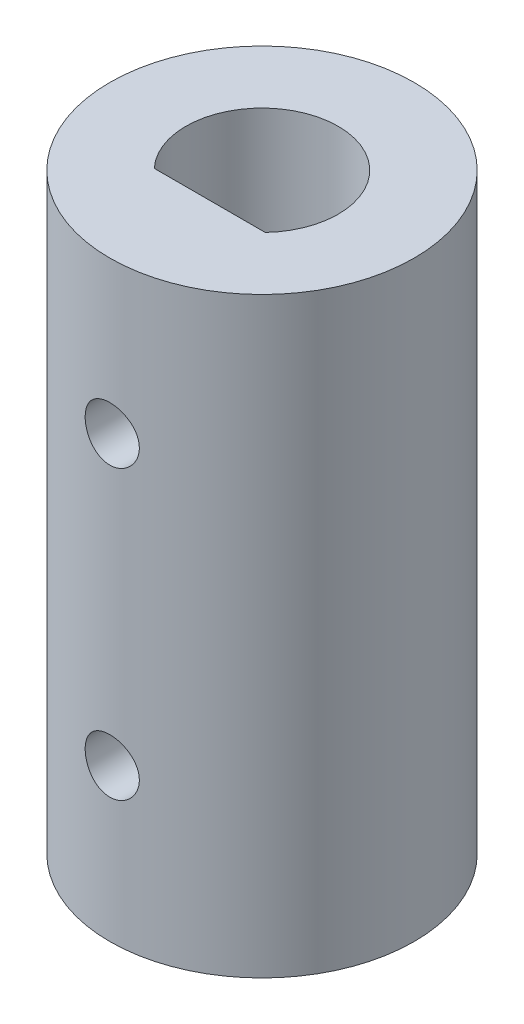
ISO-10303-21;
HEADER;
FILE_DESCRIPTION(('STEP AP214'),'2;1');
FILE_NAME('part.step','',(''),(''),'','','');
FILE_SCHEMA(('AUTOMOTIVE_DESIGN { 1 0 10303 214 1 1 1 1 }'));
ENDSEC;
DATA;
#1=APPLICATION_CONTEXT('core data for automotive mechanical design processes');
#2=APPLICATION_PROTOCOL_DEFINITION('international standard','automotive_design',2000,#1);
#3=PRODUCT_CONTEXT('',#1,'mechanical');
#4=PRODUCT('Part','Part','',(#3));
#5=PRODUCT_RELATED_PRODUCT_CATEGORY('part','',(#4));
#6=PRODUCT_DEFINITION_FORMATION('','',#4);
#7=PRODUCT_DEFINITION_CONTEXT('part definition',#1,'design');
#8=PRODUCT_DEFINITION('design','',#6,#7);
#9=PRODUCT_DEFINITION_SHAPE('','',#8);
#10=(LENGTH_UNIT() NAMED_UNIT(*) SI_UNIT(.MILLI.,.METRE.));
#11=(NAMED_UNIT(*) PLANE_ANGLE_UNIT() SI_UNIT($,.RADIAN.));
#12=(NAMED_UNIT(*) SI_UNIT($,.STERADIAN.) SOLID_ANGLE_UNIT());
#13=UNCERTAINTY_MEASURE_WITH_UNIT(LENGTH_MEASURE(1.E-05),#10,'distance_accuracy_value','');
#14=(GEOMETRIC_REPRESENTATION_CONTEXT(3) GLOBAL_UNCERTAINTY_ASSIGNED_CONTEXT((#13)) GLOBAL_UNIT_ASSIGNED_CONTEXT((#10,
#11,#12)) REPRESENTATION_CONTEXT('',''));
#15=CARTESIAN_POINT('',(0.,0.,0.));
#16=DIRECTION('',(0.,0.,1.));
#17=DIRECTION('',(1.,0.,0.));
#18=AXIS2_PLACEMENT_3D('',#15,#16,#17);
#19=CARTESIAN_POINT('',(0.,0.,0.));
#20=DIRECTION('',(0.,1.,0.));
#21=DIRECTION('',(0.,0.,1.));
#22=AXIS2_PLACEMENT_3D('',#19,#20,#21);
#23=PLANE('',#22);
#24=CARTESIAN_POINT('',(0.,0.,0.));
#25=DIRECTION('',(0.,1.,0.));
#26=DIRECTION('',(0.,0.,1.));
#27=AXIS2_PLACEMENT_3D('',#24,#25,#26);
#28=CIRCLE('',#27,6.35);
#29=CARTESIAN_POINT('',(0.,0.,6.35));
#30=VERTEX_POINT('',#29);
#31=EDGE_CURVE('E53',#30,#30,#28,.T.);
#32=ORIENTED_EDGE('',*,*,#31,.F.);
#33=EDGE_LOOP('',(#32));
#34=FACE_BOUND('',#33,.T.);
#35=CARTESIAN_POINT('',(0.,0.,0.));
#36=DIRECTION('',(0.,1.,0.));
#37=DIRECTION('',(0.,0.,1.));
#38=AXIS2_PLACEMENT_3D('',#35,#36,#37);
#39=CIRCLE('',#38,4.26033282336529);
#40=CARTESIAN_POINT('',(2.74238320566813,0.,3.26033282336529));
#41=VERTEX_POINT('',#40);
#42=CARTESIAN_POINT('',(-2.74238320566813,0.,3.26033282336529));
#43=VERTEX_POINT('',#42);
#44=EDGE_CURVE('E67',#41,#43,#39,.T.);
#45=ORIENTED_EDGE('',*,*,#44,.T.);
#46=DIRECTION('',(1.,0.,0.));
#47=VECTOR('',#46,1.);
#48=CARTESIAN_POINT('',(-2.74238320566813,0.,3.26033282336529));
#49=LINE('',#48,#47);
#50=EDGE_CURVE('E133',#43,#41,#49,.T.);
#51=ORIENTED_EDGE('',*,*,#50,.T.);
#52=EDGE_LOOP('',(#45,#51));
#53=FACE_BOUND('',#52,.T.);
#54=ADVANCED_FACE('F39',(#34,#53),#23,.F.);
#55=CARTESIAN_POINT('',(0.,12.35,0.));
#56=DIRECTION('',(0.,-1.,0.));
#57=DIRECTION('',(0.,0.,-1.));
#58=AXIS2_PLACEMENT_3D('',#55,#56,#57);
#59=CYLINDRICAL_SURFACE('',#58,6.35);
#60=CARTESIAN_POINT('',(0.,17.22,6.35));
#61=CARTESIAN_POINT('',(-0.062939957700819,17.2200024637697,6.34999888434963));
#62=CARTESIAN_POINT('',(-0.125912656247927,17.2252763142626,6.34905452477746));
#63=CARTESIAN_POINT('',(-0.250087457676584,17.2462210665218,6.34537826804387));
#64=CARTESIAN_POINT('',(-0.311287953507829,17.261901114493,6.34264479842876));
#65=CARTESIAN_POINT('',(-0.430104209618957,17.3031661781344,6.33569648349699));
#66=CARTESIAN_POINT('',(-0.48772301428377,17.3287426445925,6.33148291707934));
#67=CARTESIAN_POINT('',(-0.597845251075667,17.3890511246943,6.32203602195574));
#68=CARTESIAN_POINT('',(-0.650349176827809,17.4237822536416,6.31680279180169));
#69=CARTESIAN_POINT('',(-0.749326542742327,17.501814115411,6.30583196424201));
#70=CARTESIAN_POINT('',(-0.795736518187856,17.5451947379225,6.30008996521651));
#71=CARTESIAN_POINT('',(-0.880659922550114,17.6391222564569,6.28878190547747));
#72=CARTESIAN_POINT('',(-0.919172817680827,17.6896696365109,6.2832158566784));
#73=CARTESIAN_POINT('',(-0.987468276358078,17.7969384519111,6.27284721499309));
#74=CARTESIAN_POINT('',(-1.01718712579184,17.8537010498348,6.2680503039156));
#75=CARTESIAN_POINT('',(-1.06664321936906,17.9715126375646,6.2598246594552));
#76=CARTESIAN_POINT('',(-1.08638123544489,18.0325612954645,6.25639582026793));
#77=CARTESIAN_POINT('',(-1.11511342949689,18.1565358875387,6.2513386355925));
#78=CARTESIAN_POINT('',(-1.12421777540382,18.2194355221677,6.24969184097199));
#79=CARTESIAN_POINT('',(-1.13176596837167,18.3458895064267,6.24832949681279));
#80=CARTESIAN_POINT('',(-1.13021067573572,18.4094438028079,6.24861379142245));
#81=CARTESIAN_POINT('',(-1.11657326235129,18.5346104523972,6.25106468394744));
#82=CARTESIAN_POINT('',(-1.10461569460633,18.5962368762426,6.25320900966246));
#83=CARTESIAN_POINT('',(-1.07070899066206,18.716594677856,6.25910342730552));
#84=CARTESIAN_POINT('',(-1.0487594683294,18.775325943645,6.26285358128956));
#85=CARTESIAN_POINT('',(-0.995368011244416,18.8885946785177,6.27156075796024));
#86=CARTESIAN_POINT('',(-0.963875111111271,18.9431076076952,6.27652423203582));
#87=CARTESIAN_POINT('',(-0.892326975518066,19.0461223228183,6.28709442722225));
#88=CARTESIAN_POINT('',(-0.852270954816914,19.0946235568445,6.29270120730262));
#89=CARTESIAN_POINT('',(-0.764058733569576,19.1849583861128,6.30402370831999));
#90=CARTESIAN_POINT('',(-0.71579584015201,19.226687813058,6.30973984748415));
#91=CARTESIAN_POINT('',(-0.61289869432718,19.3014726924902,6.3205638240554));
#92=CARTESIAN_POINT('',(-0.558264389488846,19.3345280735903,6.32567165645596));
#93=CARTESIAN_POINT('',(-0.444071695660479,19.3910391002486,6.33471231748266));
#94=CARTESIAN_POINT('',(-0.384508223415675,19.4144846835163,6.33864391333014));
#95=CARTESIAN_POINT('',(-0.262203103564913,19.4510093616679,6.34487943237008));
#96=CARTESIAN_POINT('',(-0.199461760195385,19.4640894469143,6.34718351105993));
#97=CARTESIAN_POINT('',(-0.073478858896344,19.4793686289019,6.34988324240335));
#98=CARTESIAN_POINT('',(-0.0102551452022496,19.4817105803858,6.35030394870282));
#99=CARTESIAN_POINT('',(0.115680807166265,19.4758291047197,6.34925846225552));
#100=CARTESIAN_POINT('',(0.178393068260352,19.467606143218,6.34779235267011));
#101=CARTESIAN_POINT('',(0.301078429103726,19.4409470635608,6.3431535233318));
#102=CARTESIAN_POINT('',(0.361067567619187,19.4225824942053,6.33999276379296));
#103=CARTESIAN_POINT('',(0.477115542966497,19.3762383826707,6.33231756519775));
#104=CARTESIAN_POINT('',(0.533174133877714,19.348258239524,6.32780304153415));
#105=CARTESIAN_POINT('',(0.640384525168204,19.2831558696105,6.31785868215815));
#106=CARTESIAN_POINT('',(0.691481941351824,19.2459454325524,6.31242018443781));
#107=CARTESIAN_POINT('',(0.786758391627042,19.1635590330923,6.30125515306999));
#108=CARTESIAN_POINT('',(0.830936847372643,19.1183824054781,6.29552859539679));
#109=CARTESIAN_POINT('',(0.911657891901744,19.0207020682917,6.28435073267801));
#110=CARTESIAN_POINT('',(0.94810343817564,18.9681176217865,6.27890351026718));
#111=CARTESIAN_POINT('',(1.01164397617943,18.857488913359,6.26898037808471));
#112=CARTESIAN_POINT('',(1.03873929277566,18.7994448412162,6.26450443456875));
#113=CARTESIAN_POINT('',(1.08266905763519,18.6798026798861,6.25706202453356));
#114=CARTESIAN_POINT('',(1.09954978675862,18.6182220262732,6.25408875984629));
#115=CARTESIAN_POINT('',(1.12271538156272,18.4930412979424,6.2499720818292));
#116=CARTESIAN_POINT('',(1.12900131160193,18.4294414267301,6.2488284846907));
#117=CARTESIAN_POINT('',(1.13076603971789,18.302998195127,6.24850929319388));
#118=CARTESIAN_POINT('',(1.12639774759767,18.2401569875695,6.24930585339935));
#119=CARTESIAN_POINT('',(1.1073108518908,18.1161194424305,6.25271581916397));
#120=CARTESIAN_POINT('',(1.0925922961175,18.0549230972518,6.25532921633018));
#121=CARTESIAN_POINT('',(1.05328443387376,17.9359837727612,6.26206720107938));
#122=CARTESIAN_POINT('',(1.02871008961607,17.8782357105489,6.26618949715672));
#123=CARTESIAN_POINT('',(0.970404434971471,17.7676575027985,6.27548268489756));
#124=CARTESIAN_POINT('',(0.936672567531123,17.7148276566989,6.28065364034631));
#125=CARTESIAN_POINT('',(0.860471089982822,17.6148164095938,6.29154882500414));
#126=CARTESIAN_POINT('',(0.817889609705639,17.5677209435172,6.29727958408207));
#127=CARTESIAN_POINT('',(0.725432295520822,17.4812922312998,6.30859831056718));
#128=CARTESIAN_POINT('',(0.67555478584212,17.4419607733058,6.31418624482268));
#129=CARTESIAN_POINT('',(0.569445223963213,17.3718856685687,6.32464183033691));
#130=CARTESIAN_POINT('',(0.51316557349839,17.3412131653736,6.32950336839369));
#131=CARTESIAN_POINT('',(0.396186039696226,17.2898064926686,6.33789887797285));
#132=CARTESIAN_POINT('',(0.335490492911395,17.2690627206178,6.34143413148865));
#133=CARTESIAN_POINT('',(0.228823740973168,17.2424523318581,6.34603388241872));
#134=CARTESIAN_POINT('',(0.183486832522363,17.234046663634,6.34751299148448));
#135=CARTESIAN_POINT('',(0.0921057844594928,17.2228196556706,6.34949644812483));
#136=CARTESIAN_POINT('',(0.0460616599398396,17.2199981969273,6.35000081647192));
#137=CARTESIAN_POINT('',(0.,17.22,6.35));
#138=B_SPLINE_CURVE_WITH_KNOTS('',3,(#60,#61,#62,#63,#64,#65,#66,#67,#68,#69,#70,#71,#72,#73,
#74,#75,#76,#77,#78,#79,#80,#81,#82,#83,#84,#85,#86,#87,#88,#89,#90,#91,#92,#93,#94,#95,#96,#97,
#98,#99,#100,#101,#102,#103,#104,#105,#106,#107,#108,#109,#110,#111,#112,#113,#114,#115,#116,
#117,#118,#119,#120,#121,#122,#123,#124,#125,#126,#127,#128,#129,#130,#131,#132,#133,#134,#135,
#136,#137),.UNSPECIFIED.,.T.,.F.,(4,2,2,2,2,2,2,2,2,2,2,2,2,2,2,2,2,2,2,2,2,2,2,2,2,2,2,2,2,2,2,
2,2,2,2,2,2,2,4),(0.,0.18865146190767,0.377468953151042,0.566123693618801,0.754760209382761,
0.945227273032744,1.13570720665004,1.32753518070258,1.51934831622696,1.70915607127828,
1.89894850777232,2.08649923979312,2.27405722021965,2.46263503412746,2.6512301481088,
2.84249646693217,3.03376435981897,3.22523201825415,3.41668138087569,3.60557626311063,
3.7944628200937,3.98203350315197,4.16961591139971,4.35906512869482,4.54853017333656,
4.74024809805132,4.93195936100736,5.12279537318303,5.31361221273967,5.50170659778936,
5.68980011393742,5.87760915701834,6.06542962711113,6.25578707201862,6.44618830757179,
6.63811117978734,6.82984805744878,6.96791273037186,7.10597446099535),.UNSPECIFIED.);
#139=CARTESIAN_POINT('',(0.,17.22,6.35));
#140=VERTEX_POINT('',#139);
#141=EDGE_CURVE('E11',#140,#140,#138,.T.);
#142=ORIENTED_EDGE('',*,*,#141,.T.);
#143=EDGE_LOOP('',(#142));
#144=FACE_BOUND('',#143,.T.);
#145=CARTESIAN_POINT('',(0.,5.22,6.35));
#146=CARTESIAN_POINT('',(-0.0629399577008189,5.22000246376968,6.34999888434963));
#147=CARTESIAN_POINT('',(-0.125912656247927,5.22527631426259,6.34905452477746));
#148=CARTESIAN_POINT('',(-0.250087457676584,5.24622106652184,6.34537826804387));
#149=CARTESIAN_POINT('',(-0.311287953507829,5.26190111449297,6.34264479842876));
#150=CARTESIAN_POINT('',(-0.430104209618958,5.30316617813443,6.33569648349699));
#151=CARTESIAN_POINT('',(-0.487723014283772,5.32874264459251,6.33148291707934));
#152=CARTESIAN_POINT('',(-0.597845251075668,5.38905112469427,6.32203602195574));
#153=CARTESIAN_POINT('',(-0.65034917682781,5.42378225364159,6.31680279180169));
#154=CARTESIAN_POINT('',(-0.749326542742327,5.50181411541102,6.30583196424201));
#155=CARTESIAN_POINT('',(-0.795736518187856,5.54519473792252,6.30008996521651));
#156=CARTESIAN_POINT('',(-0.880659922550114,5.63912225645694,6.28878190547747));
#157=CARTESIAN_POINT('',(-0.919172817680827,5.68966963651094,6.2832158566784));
#158=CARTESIAN_POINT('',(-0.987468276358078,5.79693845191112,6.27284721499309));
#159=CARTESIAN_POINT('',(-1.01718712579183,5.85370104983483,6.2680503039156));
#160=CARTESIAN_POINT('',(-1.06664321936906,5.97151263756463,6.2598246594552));
#161=CARTESIAN_POINT('',(-1.08638123544489,6.0325612954645,6.25639582026793));
#162=CARTESIAN_POINT('',(-1.11511342949689,6.15653588753875,6.2513386355925));
#163=CARTESIAN_POINT('',(-1.12421777540382,6.21943552216768,6.24969184097199));
#164=CARTESIAN_POINT('',(-1.13176596837167,6.34588950642672,6.24832949681279));
#165=CARTESIAN_POINT('',(-1.13021067573572,6.40944380280794,6.24861379142245));
#166=CARTESIAN_POINT('',(-1.11657326235129,6.53461045239716,6.25106468394744));
#167=CARTESIAN_POINT('',(-1.10461569460632,6.59623687624261,6.25320900966246));
#168=CARTESIAN_POINT('',(-1.07070899066206,6.71659467785598,6.25910342730552));
#169=CARTESIAN_POINT('',(-1.0487594683294,6.77532594364497,6.26285358128956));
#170=CARTESIAN_POINT('',(-0.995368011244416,6.88859467851765,6.27156075796024));
#171=CARTESIAN_POINT('',(-0.963875111111271,6.94310760769521,6.27652423203582));
#172=CARTESIAN_POINT('',(-0.892326975518065,7.04612232281828,6.28709442722226));
#173=CARTESIAN_POINT('',(-0.852270954816915,7.09462355684448,6.29270120730262));
#174=CARTESIAN_POINT('',(-0.764058733569578,7.18495838611279,6.30402370831999));
#175=CARTESIAN_POINT('',(-0.71579584015201,7.22668781305796,6.30973984748415));
#176=CARTESIAN_POINT('',(-0.612898694327181,7.3014726924902,6.3205638240554));
#177=CARTESIAN_POINT('',(-0.558264389488846,7.33452807359028,6.32567165645596));
#178=CARTESIAN_POINT('',(-0.44407169566048,7.39103910024864,6.33471231748266));
#179=CARTESIAN_POINT('',(-0.384508223415676,7.41448468351626,6.33864391333014));
#180=CARTESIAN_POINT('',(-0.262203103564914,7.45100936166794,6.34487943237008));
#181=CARTESIAN_POINT('',(-0.199461760195386,7.46408944691429,6.34718351105993));
#182=CARTESIAN_POINT('',(-0.073478858896345,7.47936862890195,6.34988324240335));
#183=CARTESIAN_POINT('',(-0.0102551452022505,7.48171058038585,6.35030394870282));
#184=CARTESIAN_POINT('',(0.115680807166265,7.47582910471972,6.34925846225552));
#185=CARTESIAN_POINT('',(0.178393068260351,7.46760614321799,6.34779235267011));
#186=CARTESIAN_POINT('',(0.301078429103725,7.44094706356084,6.3431535233318));
#187=CARTESIAN_POINT('',(0.361067567619186,7.42258249420532,6.33999276379296));
#188=CARTESIAN_POINT('',(0.477115542966496,7.37623838267074,6.33231756519775));
#189=CARTESIAN_POINT('',(0.533174133877713,7.34825823952402,6.32780304153415));
#190=CARTESIAN_POINT('',(0.640384525168203,7.28315586961047,6.31785868215815));
#191=CARTESIAN_POINT('',(0.691481941351822,7.24594543255239,6.31242018443781));
#192=CARTESIAN_POINT('',(0.786758391627041,7.16355903309232,6.30125515306999));
#193=CARTESIAN_POINT('',(0.830936847372642,7.11838240547815,6.29552859539679));
#194=CARTESIAN_POINT('',(0.911657891901743,7.02070206829171,6.28435073267801));
#195=CARTESIAN_POINT('',(0.948103438175639,6.96811762178654,6.27890351026718));
#196=CARTESIAN_POINT('',(1.01164397617943,6.85748891335899,6.26898037808471));
#197=CARTESIAN_POINT('',(1.03873929277566,6.79944484121618,6.26450443456875));
#198=CARTESIAN_POINT('',(1.08266905763519,6.67980267988611,6.25706202453356));
#199=CARTESIAN_POINT('',(1.09954978675862,6.61822202627323,6.25408875984629));
#200=CARTESIAN_POINT('',(1.12271538156272,6.49304129794239,6.2499720818292));
#201=CARTESIAN_POINT('',(1.12900131160193,6.4294414267301,6.2488284846907));
#202=CARTESIAN_POINT('',(1.13076603971789,6.302998195127,6.24850929319388));
#203=CARTESIAN_POINT('',(1.12639774759767,6.24015698756952,6.24930585339935));
#204=CARTESIAN_POINT('',(1.1073108518908,6.11611944243052,6.25271581916397));
#205=CARTESIAN_POINT('',(1.0925922961175,6.05492309725185,6.25532921633018));
#206=CARTESIAN_POINT('',(1.05328443387376,5.9359837727612,6.26206720107938));
#207=CARTESIAN_POINT('',(1.02871008961607,5.87823571054885,6.26618949715672));
#208=CARTESIAN_POINT('',(0.970404434971471,5.76765750279848,6.27548268489756));
#209=CARTESIAN_POINT('',(0.936672567531123,5.71482765669886,6.28065364034631));
#210=CARTESIAN_POINT('',(0.860471089982822,5.61481640959378,6.29154882500414));
#211=CARTESIAN_POINT('',(0.817889609705639,5.56772094351719,6.29727958408207));
#212=CARTESIAN_POINT('',(0.725432295520822,5.48129223129982,6.30859831056718));
#213=CARTESIAN_POINT('',(0.67555478584212,5.44196077330582,6.31418624482268));
#214=CARTESIAN_POINT('',(0.569445223963213,5.37188566856867,6.32464183033691));
#215=CARTESIAN_POINT('',(0.51316557349839,5.34121316537356,6.32950336839369));
#216=CARTESIAN_POINT('',(0.396186039696227,5.2898064926686,6.33789887797285));
#217=CARTESIAN_POINT('',(0.335490492911396,5.26906272061777,6.34143413148865));
#218=CARTESIAN_POINT('',(0.22882374097317,5.24245233185806,6.34603388241872));
#219=CARTESIAN_POINT('',(0.183486832522364,5.23404666363404,6.34751299148448));
#220=CARTESIAN_POINT('',(0.0921057844594938,5.22281965567062,6.34949644812483));
#221=CARTESIAN_POINT('',(0.0460616599398401,5.21999819692727,6.35000081647192));
#222=CARTESIAN_POINT('',(0.,5.22,6.35));
#223=B_SPLINE_CURVE_WITH_KNOTS('',3,(#145,#146,#147,#148,#149,#150,#151,#152,#153,#154,#155,
#156,#157,#158,#159,#160,#161,#162,#163,#164,#165,#166,#167,#168,#169,#170,#171,#172,#173,#174,
#175,#176,#177,#178,#179,#180,#181,#182,#183,#184,#185,#186,#187,#188,#189,#190,#191,#192,#193,
#194,#195,#196,#197,#198,#199,#200,#201,#202,#203,#204,#205,#206,#207,#208,#209,#210,#211,#212,
#213,#214,#215,#216,#217,#218,#219,#220,#221,#222),.UNSPECIFIED.,.T.,.F.,(4,2,2,2,2,2,2,2,2,2,2,
2,2,2,2,2,2,2,2,2,2,2,2,2,2,2,2,2,2,2,2,2,2,2,2,2,2,2,4),(0.,0.18865146190767,0.377468953151042,
0.566123693618804,0.754760209382761,0.945227273032744,1.13570720665004,1.32753518070258,
1.51934831622696,1.70915607127829,1.89894850777233,2.08649923979312,2.27405722021965,
2.46263503412747,2.6512301481088,2.84249646693217,3.03376435981897,3.22523201825415,
3.41668138087569,3.60557626311063,3.7944628200937,3.98203350315197,4.16961591139971,
4.35906512869482,4.54853017333656,4.74024809805131,4.93195936100736,5.12279537318303,
5.31361221273967,5.50170659778936,5.68980011393742,5.87760915701834,6.06542962711112,
6.25578707201862,6.44618830757179,6.63811117978734,6.82984805744878,6.96791273037185,
7.10597446099535),.UNSPECIFIED.);
#224=CARTESIAN_POINT('',(0.,5.22,6.35));
#225=VERTEX_POINT('',#224);
#226=EDGE_CURVE('E114',#225,#225,#223,.T.);
#227=ORIENTED_EDGE('',*,*,#226,.T.);
#228=EDGE_LOOP('',(#227));
#229=FACE_BOUND('',#228,.T.);
#230=ORIENTED_EDGE('',*,*,#31,.T.);
#231=EDGE_LOOP('',(#230));
#232=FACE_BOUND('',#231,.T.);
#233=CARTESIAN_POINT('',(0.,24.7,0.));
#234=DIRECTION('',(0.,1.,0.));
#235=DIRECTION('',(0.,0.,1.));
#236=AXIS2_PLACEMENT_3D('',#233,#234,#235);
#237=CIRCLE('',#236,6.35);
#238=CARTESIAN_POINT('',(0.,24.7,6.35));
#239=VERTEX_POINT('',#238);
#240=EDGE_CURVE('E125',#239,#239,#237,.T.);
#241=ORIENTED_EDGE('',*,*,#240,.F.);
#242=EDGE_LOOP('',(#241));
#243=FACE_BOUND('',#242,.T.);
#244=ADVANCED_FACE('F41',(#144,#229,#232,#243),#59,.T.);
#245=CARTESIAN_POINT('',(0.,12.35,0.));
#246=DIRECTION('',(0.,-1.,0.));
#247=DIRECTION('',(0.,0.,-1.));
#248=AXIS2_PLACEMENT_3D('',#245,#246,#247);
#249=CYLINDRICAL_SURFACE('',#248,4.26033282336529);
#250=ORIENTED_EDGE('',*,*,#44,.F.);
#251=DIRECTION('',(0.,-1.,0.));
#252=VECTOR('',#251,1.);
#253=CARTESIAN_POINT('',(2.74238320566813,12.35,3.26033282336529));
#254=LINE('',#253,#252);
#255=CARTESIAN_POINT('',(2.74238320566813,12.35,3.26033282336529));
#256=VERTEX_POINT('',#255);
#257=EDGE_CURVE('E136',#256,#41,#254,.T.);
#258=ORIENTED_EDGE('',*,*,#257,.F.);
#259=CARTESIAN_POINT('',(0.,12.35,0.));
#260=DIRECTION('',(0.,1.,0.));
#261=DIRECTION('',(0.,0.,1.));
#262=AXIS2_PLACEMENT_3D('',#259,#260,#261);
#263=CIRCLE('',#262,4.26033282336529);
#264=CARTESIAN_POINT('',(-2.74238320566813,12.35,3.26033282336529));
#265=VERTEX_POINT('',#264);
#266=EDGE_CURVE('E129',#256,#265,#263,.T.);
#267=ORIENTED_EDGE('',*,*,#266,.T.);
#268=DIRECTION('',(0.,-1.,0.));
#269=VECTOR('',#268,1.);
#270=CARTESIAN_POINT('',(-2.74238320566813,12.35,3.26033282336529));
#271=LINE('',#270,#269);
#272=EDGE_CURVE('E144',#265,#43,#271,.T.);
#273=ORIENTED_EDGE('',*,*,#272,.T.);
#274=EDGE_LOOP('',(#250,#258,#267,#273));
#275=FACE_BOUND('',#274,.T.);
#276=ADVANCED_FACE('F156',(#275),#249,.F.);
#277=CARTESIAN_POINT('',(-2.74238320566813,12.35,3.26033282336529));
#278=DIRECTION('',(0.,0.,-1.));
#279=DIRECTION('',(-1.,0.,0.));
#280=AXIS2_PLACEMENT_3D('',#277,#278,#279);
#281=PLANE('',#280);
#282=CARTESIAN_POINT('',(0.,6.35,3.26033282336529));
#283=DIRECTION('',(0.,0.,-1.));
#284=DIRECTION('',(1.,0.,0.));
#285=AXIS2_PLACEMENT_3D('',#282,#283,#284);
#286=CIRCLE('',#285,1.13);
#287=CARTESIAN_POINT('',(1.13,6.35,3.26033282336529));
#288=VERTEX_POINT('',#287);
#289=EDGE_CURVE('E187',#288,#288,#286,.T.);
#290=ORIENTED_EDGE('',*,*,#289,.F.);
#291=EDGE_LOOP('',(#290));
#292=FACE_BOUND('',#291,.T.);
#293=ORIENTED_EDGE('',*,*,#50,.F.);
#294=ORIENTED_EDGE('',*,*,#272,.F.);
#295=DIRECTION('',(1.,0.,0.));
#296=VECTOR('',#295,1.);
#297=CARTESIAN_POINT('',(-2.74238320566813,12.35,3.26033282336529));
#298=LINE('',#297,#296);
#299=EDGE_CURVE('E59',#265,#256,#298,.T.);
#300=ORIENTED_EDGE('',*,*,#299,.T.);
#301=ORIENTED_EDGE('',*,*,#257,.T.);
#302=EDGE_LOOP('',(#293,#294,#300,#301));
#303=FACE_BOUND('',#302,.T.);
#304=ADVANCED_FACE('F155',(#292,#303),#281,.T.);
#305=CARTESIAN_POINT('',(0.,12.35,0.));
#306=DIRECTION('',(0.,1.,0.));
#307=DIRECTION('',(0.,0.,1.));
#308=AXIS2_PLACEMENT_3D('',#305,#306,#307);
#309=PLANE('',#308);
#310=CARTESIAN_POINT('',(0.,12.35,0.));
#311=DIRECTION('',(0.,1.,0.));
#312=DIRECTION('',(0.,0.,1.));
#313=AXIS2_PLACEMENT_3D('',#310,#311,#312);
#314=CIRCLE('',#313,3.18);
#315=CARTESIAN_POINT('',(2.31516738055805,12.35,2.18));
#316=VERTEX_POINT('',#315);
#317=CARTESIAN_POINT('',(-2.31516738055805,12.35,2.18));
#318=VERTEX_POINT('',#317);
#319=EDGE_CURVE('E104',#316,#318,#314,.T.);
#320=ORIENTED_EDGE('',*,*,#319,.T.);
#321=DIRECTION('',(1.,0.,0.));
#322=VECTOR('',#321,1.);
#323=CARTESIAN_POINT('',(-2.31516738055805,12.35,2.18));
#324=LINE('',#323,#322);
#325=EDGE_CURVE('E109',#318,#316,#324,.T.);
#326=ORIENTED_EDGE('',*,*,#325,.T.);
#327=EDGE_LOOP('',(#320,#326));
#328=FACE_BOUND('',#327,.T.);
#329=ORIENTED_EDGE('',*,*,#299,.F.);
#330=ORIENTED_EDGE('',*,*,#266,.F.);
#331=EDGE_LOOP('',(#329,#330));
#332=FACE_BOUND('',#331,.T.);
#333=ADVANCED_FACE('F157',(#328,#332),#309,.F.);
#334=CARTESIAN_POINT('',(0.,24.7,0.));
#335=DIRECTION('',(0.,1.,0.));
#336=DIRECTION('',(0.,0.,1.));
#337=AXIS2_PLACEMENT_3D('',#334,#335,#336);
#338=PLANE('',#337);
#339=ORIENTED_EDGE('',*,*,#240,.T.);
#340=EDGE_LOOP('',(#339));
#341=FACE_BOUND('',#340,.T.);
#342=DIRECTION('',(1.,0.,0.));
#343=VECTOR('',#342,1.);
#344=CARTESIAN_POINT('',(-2.31516738055805,24.7,2.18));
#345=LINE('',#344,#343);
#346=CARTESIAN_POINT('',(-2.31516738055805,24.7,2.18));
#347=VERTEX_POINT('',#346);
#348=CARTESIAN_POINT('',(2.31516738055805,24.7,2.18));
#349=VERTEX_POINT('',#348);
#350=EDGE_CURVE('E88',#347,#349,#345,.T.);
#351=ORIENTED_EDGE('',*,*,#350,.F.);
#352=CARTESIAN_POINT('',(0.,24.7,0.));
#353=DIRECTION('',(0.,1.,0.));
#354=DIRECTION('',(0.,0.,1.));
#355=AXIS2_PLACEMENT_3D('',#352,#353,#354);
#356=CIRCLE('',#355,3.18);
#357=EDGE_CURVE('E99',#349,#347,#356,.T.);
#358=ORIENTED_EDGE('',*,*,#357,.F.);
#359=EDGE_LOOP('',(#351,#358));
#360=FACE_BOUND('',#359,.T.);
#361=ADVANCED_FACE('F107',(#341,#360),#338,.T.);
#362=CARTESIAN_POINT('',(0.,24.7,0.));
#363=DIRECTION('',(0.,-1.,0.));
#364=DIRECTION('',(0.,0.,-1.));
#365=AXIS2_PLACEMENT_3D('',#362,#363,#364);
#366=CYLINDRICAL_SURFACE('',#365,3.18);
#367=ORIENTED_EDGE('',*,*,#319,.F.);
#368=DIRECTION('',(0.,-1.,0.));
#369=VECTOR('',#368,1.);
#370=CARTESIAN_POINT('',(2.31516738055805,24.7,2.18));
#371=LINE('',#370,#369);
#372=EDGE_CURVE('E91',#349,#316,#371,.T.);
#373=ORIENTED_EDGE('',*,*,#372,.F.);
#374=ORIENTED_EDGE('',*,*,#357,.T.);
#375=DIRECTION('',(0.,-1.,0.));
#376=VECTOR('',#375,1.);
#377=CARTESIAN_POINT('',(-2.31516738055805,24.7,2.18));
#378=LINE('',#377,#376);
#379=EDGE_CURVE('E94',#347,#318,#378,.T.);
#380=ORIENTED_EDGE('',*,*,#379,.T.);
#381=EDGE_LOOP('',(#367,#373,#374,#380));
#382=FACE_BOUND('',#381,.T.);
#383=ADVANCED_FACE('F102',(#382),#366,.F.);
#384=CARTESIAN_POINT('',(-2.31516738055805,24.7,2.18));
#385=DIRECTION('',(0.,0.,-1.));
#386=DIRECTION('',(-1.,0.,0.));
#387=AXIS2_PLACEMENT_3D('',#384,#385,#386);
#388=PLANE('',#387);
#389=ORIENTED_EDGE('',*,*,#325,.F.);
#390=ORIENTED_EDGE('',*,*,#379,.F.);
#391=ORIENTED_EDGE('',*,*,#350,.T.);
#392=ORIENTED_EDGE('',*,*,#372,.T.);
#393=EDGE_LOOP('',(#389,#390,#391,#392));
#394=FACE_BOUND('',#393,.T.);
#395=ADVANCED_FACE('F90',(#394),#388,.T.);
#396=CARTESIAN_POINT('',(0.,6.35,6.35));
#397=DIRECTION('',(0.,0.,-1.));
#398=DIRECTION('',(-1.,0.,0.));
#399=AXIS2_PLACEMENT_3D('',#396,#397,#398);
#400=CYLINDRICAL_SURFACE('',#399,1.13);
#401=ORIENTED_EDGE('',*,*,#289,.T.);
#402=EDGE_LOOP('',(#401));
#403=FACE_BOUND('',#402,.T.);
#404=ORIENTED_EDGE('',*,*,#226,.F.);
#405=EDGE_LOOP('',(#404));
#406=FACE_BOUND('',#405,.T.);
#407=ADVANCED_FACE('F195',(#403,#406),#400,.F.);
#408=CARTESIAN_POINT('',(0.,18.35,6.35));
#409=DIRECTION('',(0.,0.,-1.));
#410=DIRECTION('',(-1.,0.,0.));
#411=AXIS2_PLACEMENT_3D('',#408,#409,#410);
#412=CYLINDRICAL_SURFACE('',#411,1.13);
#413=CARTESIAN_POINT('',(0.,18.35,3.26033282336529));
#414=DIRECTION('',(0.,0.,-1.));
#415=DIRECTION('',(-1.,0.,0.));
#416=AXIS2_PLACEMENT_3D('',#413,#414,#415);
#417=CIRCLE('',#416,1.13);
#418=CARTESIAN_POINT('',(-1.13,18.35,3.26033282336529));
#419=VERTEX_POINT('',#418);
#420=EDGE_CURVE('E184',#419,#419,#417,.T.);
#421=ORIENTED_EDGE('',*,*,#420,.T.);
#422=EDGE_LOOP('',(#421));
#423=FACE_BOUND('',#422,.T.);
#424=ORIENTED_EDGE('',*,*,#141,.F.);
#425=EDGE_LOOP('',(#424));
#426=FACE_BOUND('',#425,.T.);
#427=ADVANCED_FACE('F197',(#423,#426),#412,.F.);
#428=CARTESIAN_POINT('',(0.,18.35,3.26033282336529));
#429=DIRECTION('',(0.,0.,-1.));
#430=DIRECTION('',(-1.,0.,0.));
#431=AXIS2_PLACEMENT_3D('',#428,#429,#430);
#432=PLANE('',#431);
#433=ORIENTED_EDGE('',*,*,#420,.F.);
#434=EDGE_LOOP('',(#433));
#435=FACE_BOUND('',#434,.T.);
#436=ADVANCED_FACE('F202',(#435),#432,.F.);
#437=CLOSED_SHELL('',(#54,#244,#276,#304,#333,#361,#383,#395,#407,#427,#436));
#438=MANIFOLD_SOLID_BREP('B2',#437);
#439=ADVANCED_BREP_SHAPE_REPRESENTATION('',(#18,#438),#14);
#440=SHAPE_DEFINITION_REPRESENTATION(#9,#439);
ENDSEC;
END-ISO-10303-21;
